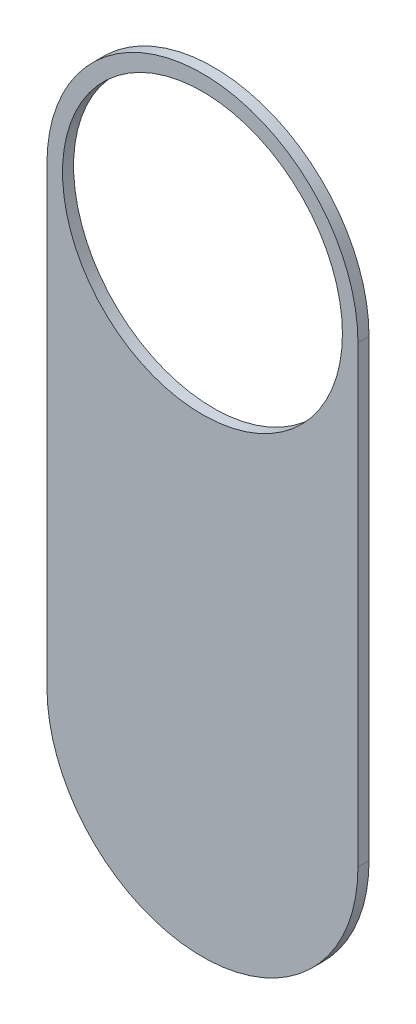
ISO-10303-21;
HEADER;
FILE_DESCRIPTION(('STEP AP214'),'2;1');
FILE_NAME('part.step','',(''),(''),'','','');
FILE_SCHEMA(('AUTOMOTIVE_DESIGN { 1 0 10303 214 1 1 1 1 }'));
ENDSEC;
DATA;
#1=APPLICATION_CONTEXT('core data for automotive mechanical design processes');
#2=APPLICATION_PROTOCOL_DEFINITION('international standard','automotive_design',2000,#1);
#3=PRODUCT_CONTEXT('',#1,'mechanical');
#4=PRODUCT('Part','Part','',(#3));
#5=PRODUCT_RELATED_PRODUCT_CATEGORY('part','',(#4));
#6=PRODUCT_DEFINITION_FORMATION('','',#4);
#7=PRODUCT_DEFINITION_CONTEXT('part definition',#1,'design');
#8=PRODUCT_DEFINITION('design','',#6,#7);
#9=PRODUCT_DEFINITION_SHAPE('','',#8);
#10=(LENGTH_UNIT() NAMED_UNIT(*) SI_UNIT(.MILLI.,.METRE.));
#11=(NAMED_UNIT(*) PLANE_ANGLE_UNIT() SI_UNIT($,.RADIAN.));
#12=(NAMED_UNIT(*) SI_UNIT($,.STERADIAN.) SOLID_ANGLE_UNIT());
#13=UNCERTAINTY_MEASURE_WITH_UNIT(LENGTH_MEASURE(1.E-05),#10,'distance_accuracy_value','');
#14=(GEOMETRIC_REPRESENTATION_CONTEXT(3) GLOBAL_UNCERTAINTY_ASSIGNED_CONTEXT((#13)) GLOBAL_UNIT_ASSIGNED_CONTEXT((#10,
#11,#12)) REPRESENTATION_CONTEXT('',''));
#15=CARTESIAN_POINT('',(0.,0.,0.));
#16=DIRECTION('',(0.,0.,1.));
#17=DIRECTION('',(1.,0.,0.));
#18=AXIS2_PLACEMENT_3D('',#15,#16,#17);
#19=CARTESIAN_POINT('',(97.859977,115.04002138,0.));
#20=DIRECTION('',(-1.,0.,0.));
#21=DIRECTION('',(0.,1.,0.));
#22=AXIS2_PLACEMENT_3D('',#19,#20,#21);
#23=PLANE('',#22);
#24=DIRECTION('',(0.,1.,0.));
#25=VECTOR('',#24,1.);
#26=CARTESIAN_POINT('',(97.859977,115.04002138,0.03556));
#27=LINE('',#26,#25);
#28=CARTESIAN_POINT('',(97.859977,115.04002138,0.03556));
#29=VERTEX_POINT('',#28);
#30=CARTESIAN_POINT('',(97.859977,116.4999956,0.03556));
#31=VERTEX_POINT('',#30);
#32=EDGE_CURVE('E11',#29,#31,#27,.T.);
#33=ORIENTED_EDGE('',*,*,#32,.F.);
#34=DIRECTION('',(0.,0.,1.));
#35=VECTOR('',#34,1.);
#36=CARTESIAN_POINT('',(97.859977,115.04002138,0.));
#37=LINE('',#36,#35);
#38=CARTESIAN_POINT('',(97.859977,115.04002138,0.));
#39=VERTEX_POINT('',#38);
#40=EDGE_CURVE('E24',#39,#29,#37,.T.);
#41=ORIENTED_EDGE('',*,*,#40,.F.);
#42=DIRECTION('',(0.,1.,0.));
#43=VECTOR('',#42,1.);
#44=CARTESIAN_POINT('',(97.859977,115.04002138,0.));
#45=LINE('',#44,#43);
#46=CARTESIAN_POINT('',(97.859977,116.4999956,0.));
#47=VERTEX_POINT('',#46);
#48=EDGE_CURVE('E96',#39,#47,#45,.T.);
#49=ORIENTED_EDGE('',*,*,#48,.T.);
#50=DIRECTION('',(0.,0.,1.));
#51=VECTOR('',#50,1.);
#52=CARTESIAN_POINT('',(97.859977,116.4999956,0.));
#53=LINE('',#52,#51);
#54=EDGE_CURVE('E37',#47,#31,#53,.T.);
#55=ORIENTED_EDGE('',*,*,#54,.T.);
#56=EDGE_LOOP('',(#33,#41,#49,#55));
#57=FACE_BOUND('',#56,.T.);
#58=ADVANCED_FACE('F17',(#57),#23,.F.);
#59=CARTESIAN_POINT('',(97.359978,115.04002138,0.));
#60=DIRECTION('',(0.,0.,-1.));
#61=DIRECTION('',(-1.,0.,0.));
#62=AXIS2_PLACEMENT_3D('',#59,#60,#61);
#63=CYLINDRICAL_SURFACE('',#62,0.499998999999998);
#64=CARTESIAN_POINT('',(97.359978,115.04002138,0.03556));
#65=DIRECTION('',(0.,0.,1.));
#66=DIRECTION('',(-1.,0.,0.));
#67=AXIS2_PLACEMENT_3D('',#64,#65,#66);
#68=CIRCLE('',#67,0.499998999999998);
#69=CARTESIAN_POINT('',(96.859979,115.04002138,0.03556));
#70=VERTEX_POINT('',#69);
#71=EDGE_CURVE('E92',#70,#29,#68,.T.);
#72=ORIENTED_EDGE('',*,*,#71,.F.);
#73=DIRECTION('',(0.,0.,1.));
#74=VECTOR('',#73,1.);
#75=CARTESIAN_POINT('',(96.859979,115.04002138,0.));
#76=LINE('',#75,#74);
#77=CARTESIAN_POINT('',(96.859979,115.04002138,0.));
#78=VERTEX_POINT('',#77);
#79=EDGE_CURVE('E90',#78,#70,#76,.T.);
#80=ORIENTED_EDGE('',*,*,#79,.F.);
#81=CARTESIAN_POINT('',(97.359978,115.04002138,0.));
#82=DIRECTION('',(0.,0.,1.));
#83=DIRECTION('',(-1.,0.,0.));
#84=AXIS2_PLACEMENT_3D('',#81,#82,#83);
#85=CIRCLE('',#84,0.499998999999998);
#86=EDGE_CURVE('E88',#78,#39,#85,.T.);
#87=ORIENTED_EDGE('',*,*,#86,.T.);
#88=ORIENTED_EDGE('',*,*,#40,.T.);
#89=EDGE_LOOP('',(#72,#80,#87,#88));
#90=FACE_BOUND('',#89,.T.);
#91=ADVANCED_FACE('F111',(#90),#63,.T.);
#92=CARTESIAN_POINT('',(97.359978,116.4999956,0.));
#93=DIRECTION('',(0.,0.,-1.));
#94=DIRECTION('',(1.,0.,0.));
#95=AXIS2_PLACEMENT_3D('',#92,#93,#94);
#96=CYLINDRICAL_SURFACE('',#95,0.499998999999993);
#97=CARTESIAN_POINT('',(97.359978,116.4999956,0.03556));
#98=DIRECTION('',(0.,0.,1.));
#99=DIRECTION('',(1.,0.,0.));
#100=AXIS2_PLACEMENT_3D('',#97,#98,#99);
#101=CIRCLE('',#100,0.499998999999993);
#102=CARTESIAN_POINT('',(96.859979,116.4999956,0.03556));
#103=VERTEX_POINT('',#102);
#104=EDGE_CURVE('E85',#31,#103,#101,.T.);
#105=ORIENTED_EDGE('',*,*,#104,.F.);
#106=ORIENTED_EDGE('',*,*,#54,.F.);
#107=CARTESIAN_POINT('',(97.359978,116.4999956,0.));
#108=DIRECTION('',(0.,0.,1.));
#109=DIRECTION('',(1.,0.,0.));
#110=AXIS2_PLACEMENT_3D('',#107,#108,#109);
#111=CIRCLE('',#110,0.499998999999993);
#112=CARTESIAN_POINT('',(96.859979,116.4999956,0.));
#113=VERTEX_POINT('',#112);
#114=EDGE_CURVE('E82',#47,#113,#111,.T.);
#115=ORIENTED_EDGE('',*,*,#114,.T.);
#116=DIRECTION('',(0.,0.,1.));
#117=VECTOR('',#116,1.);
#118=CARTESIAN_POINT('',(96.859979,116.4999956,0.));
#119=LINE('',#118,#117);
#120=EDGE_CURVE('E80',#113,#103,#119,.T.);
#121=ORIENTED_EDGE('',*,*,#120,.T.);
#122=EDGE_LOOP('',(#105,#106,#115,#121));
#123=FACE_BOUND('',#122,.T.);
#124=ADVANCED_FACE('F104',(#123),#96,.T.);
#125=CARTESIAN_POINT('',(96.859979,116.4999956,0.));
#126=DIRECTION('',(1.,0.,0.));
#127=DIRECTION('',(0.,-1.,0.));
#128=AXIS2_PLACEMENT_3D('',#125,#126,#127);
#129=PLANE('',#128);
#130=DIRECTION('',(0.,-1.,0.));
#131=VECTOR('',#130,1.);
#132=CARTESIAN_POINT('',(96.859979,116.4999956,0.03556));
#133=LINE('',#132,#131);
#134=EDGE_CURVE('E77',#103,#70,#133,.T.);
#135=ORIENTED_EDGE('',*,*,#134,.F.);
#136=ORIENTED_EDGE('',*,*,#120,.F.);
#137=DIRECTION('',(0.,-1.,0.));
#138=VECTOR('',#137,1.);
#139=CARTESIAN_POINT('',(96.859979,116.4999956,0.));
#140=LINE('',#139,#138);
#141=EDGE_CURVE('E68',#113,#78,#140,.T.);
#142=ORIENTED_EDGE('',*,*,#141,.T.);
#143=ORIENTED_EDGE('',*,*,#79,.T.);
#144=EDGE_LOOP('',(#135,#136,#142,#143));
#145=FACE_BOUND('',#144,.T.);
#146=ADVANCED_FACE('F110',(#145),#129,.F.);
#147=CARTESIAN_POINT('',(97.359978,116.4999956,0.));
#148=DIRECTION('',(0.,0.,-1.));
#149=DIRECTION('',(1.,0.,0.));
#150=AXIS2_PLACEMENT_3D('',#147,#148,#149);
#151=CYLINDRICAL_SURFACE('',#150,0.4499991);
#152=DIRECTION('',(0.,0.,1.));
#153=VECTOR('',#152,1.);
#154=CARTESIAN_POINT('',(97.8099771,116.4999956,0.));
#155=LINE('',#154,#153);
#156=CARTESIAN_POINT('',(97.8099771,116.4999956,0.));
#157=VERTEX_POINT('',#156);
#158=CARTESIAN_POINT('',(97.8099771,116.4999956,0.03556));
#159=VERTEX_POINT('',#158);
#160=EDGE_CURVE('E62',#157,#159,#155,.T.);
#161=ORIENTED_EDGE('',*,*,#160,.T.);
#162=CARTESIAN_POINT('',(97.359978,116.4999956,0.03556));
#163=DIRECTION('',(0.,0.,1.));
#164=DIRECTION('',(1.,0.,0.));
#165=AXIS2_PLACEMENT_3D('',#162,#163,#164);
#166=CIRCLE('',#165,0.4499991);
#167=EDGE_CURVE('E67',#159,#159,#166,.T.);
#168=ORIENTED_EDGE('',*,*,#167,.T.);
#169=ORIENTED_EDGE('',*,*,#160,.F.);
#170=CARTESIAN_POINT('',(97.359978,116.4999956,0.));
#171=DIRECTION('',(0.,0.,1.));
#172=DIRECTION('',(1.,0.,0.));
#173=AXIS2_PLACEMENT_3D('',#170,#171,#172);
#174=CIRCLE('',#173,0.4499991);
#175=EDGE_CURVE('E65',#157,#157,#174,.T.);
#176=ORIENTED_EDGE('',*,*,#175,.F.);
#177=EDGE_LOOP('',(#161,#168,#169,#176));
#178=FACE_BOUND('',#177,.T.);
#179=ADVANCED_FACE('F64',(#178),#151,.F.);
#180=CARTESIAN_POINT('',(97.859977,115.04002138,0.));
#181=DIRECTION('',(0.,0.,-1.));
#182=DIRECTION('',(-1.,0.,0.));
#183=AXIS2_PLACEMENT_3D('',#180,#181,#182);
#184=PLANE('',#183);
#185=ORIENTED_EDGE('',*,*,#48,.F.);
#186=ORIENTED_EDGE('',*,*,#86,.F.);
#187=ORIENTED_EDGE('',*,*,#141,.F.);
#188=ORIENTED_EDGE('',*,*,#114,.F.);
#189=EDGE_LOOP('',(#185,#186,#187,#188));
#190=FACE_BOUND('',#189,.T.);
#191=ORIENTED_EDGE('',*,*,#175,.T.);
#192=EDGE_LOOP('',(#191));
#193=FACE_BOUND('',#192,.T.);
#194=ADVANCED_FACE('F71',(#190,#193),#184,.T.);
#195=CARTESIAN_POINT('',(97.859977,115.04002138,0.03556));
#196=DIRECTION('',(0.,0.,-1.));
#197=DIRECTION('',(-1.,0.,0.));
#198=AXIS2_PLACEMENT_3D('',#195,#196,#197);
#199=PLANE('',#198);
#200=ORIENTED_EDGE('',*,*,#134,.T.);
#201=ORIENTED_EDGE('',*,*,#71,.T.);
#202=ORIENTED_EDGE('',*,*,#32,.T.);
#203=ORIENTED_EDGE('',*,*,#104,.T.);
#204=EDGE_LOOP('',(#200,#201,#202,#203));
#205=FACE_BOUND('',#204,.T.);
#206=ORIENTED_EDGE('',*,*,#167,.F.);
#207=EDGE_LOOP('',(#206));
#208=FACE_BOUND('',#207,.T.);
#209=ADVANCED_FACE('F107',(#205,#208),#199,.F.);
#210=CLOSED_SHELL('',(#58,#91,#124,#146,#179,#194,#209));
#211=MANIFOLD_SOLID_BREP('B1',#210);
#212=ADVANCED_BREP_SHAPE_REPRESENTATION('',(#18,#211),#14);
#213=SHAPE_DEFINITION_REPRESENTATION(#9,#212);
ENDSEC;
END-ISO-10303-21;
